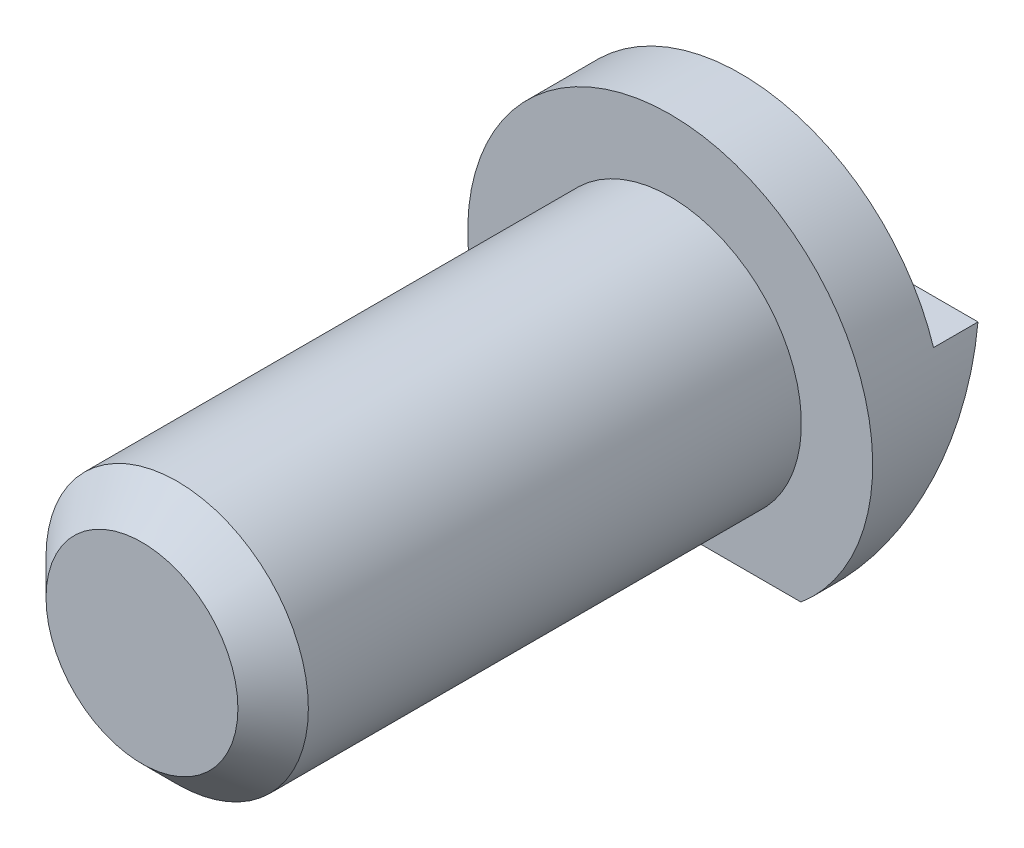
ISO-10303-21;
HEADER;
FILE_DESCRIPTION(('STEP AP214'),'2;1');
FILE_NAME('part.step','',(''),(''),'','','');
FILE_SCHEMA(('AUTOMOTIVE_DESIGN { 1 0 10303 214 1 1 1 1 }'));
ENDSEC;
DATA;
#1=APPLICATION_CONTEXT('core data for automotive mechanical design processes');
#2=APPLICATION_PROTOCOL_DEFINITION('international standard','automotive_design',2000,#1);
#3=PRODUCT_CONTEXT('',#1,'mechanical');
#4=PRODUCT('Part','Part','',(#3));
#5=PRODUCT_RELATED_PRODUCT_CATEGORY('part','',(#4));
#6=PRODUCT_DEFINITION_FORMATION('','',#4);
#7=PRODUCT_DEFINITION_CONTEXT('part definition',#1,'design');
#8=PRODUCT_DEFINITION('design','',#6,#7);
#9=PRODUCT_DEFINITION_SHAPE('','',#8);
#10=(LENGTH_UNIT() NAMED_UNIT(*) SI_UNIT(.MILLI.,.METRE.));
#11=(NAMED_UNIT(*) PLANE_ANGLE_UNIT() SI_UNIT($,.RADIAN.));
#12=(NAMED_UNIT(*) SI_UNIT($,.STERADIAN.) SOLID_ANGLE_UNIT());
#13=UNCERTAINTY_MEASURE_WITH_UNIT(LENGTH_MEASURE(1.E-05),#10,'distance_accuracy_value','');
#14=(GEOMETRIC_REPRESENTATION_CONTEXT(3) GLOBAL_UNCERTAINTY_ASSIGNED_CONTEXT((#13)) GLOBAL_UNIT_ASSIGNED_CONTEXT((#10,
#11,#12)) REPRESENTATION_CONTEXT('',''));
#15=CARTESIAN_POINT('',(0.,0.,0.));
#16=DIRECTION('',(0.,0.,1.));
#17=DIRECTION('',(1.,0.,0.));
#18=AXIS2_PLACEMENT_3D('',#15,#16,#17);
#19=CARTESIAN_POINT('',(0.,0.,15.));
#20=DIRECTION('',(0.,0.,-1.));
#21=DIRECTION('',(-1.,0.,0.));
#22=AXIS2_PLACEMENT_3D('',#19,#20,#21);
#23=CYLINDRICAL_SURFACE('',#22,3.725);
#24=CARTESIAN_POINT('',(0.,0.,14.));
#25=DIRECTION('',(0.,0.,1.));
#26=DIRECTION('',(1.,0.,0.));
#27=AXIS2_PLACEMENT_3D('',#24,#25,#26);
#28=CIRCLE('',#27,3.725);
#29=CARTESIAN_POINT('',(3.725,0.,14.));
#30=VERTEX_POINT('',#29);
#31=EDGE_CURVE('E105',#30,#30,#28,.F.);
#32=ORIENTED_EDGE('',*,*,#31,.T.);
#33=EDGE_LOOP('',(#32));
#34=FACE_BOUND('',#33,.T.);
#35=CARTESIAN_POINT('',(0.,0.,0.));
#36=DIRECTION('',(0.,0.,-1.));
#37=DIRECTION('',(-1.,0.,0.));
#38=AXIS2_PLACEMENT_3D('',#35,#36,#37);
#39=CIRCLE('',#38,3.725);
#40=CARTESIAN_POINT('',(-3.725,0.,0.));
#41=VERTEX_POINT('',#40);
#42=EDGE_CURVE('E99',#41,#41,#39,.T.);
#43=ORIENTED_EDGE('',*,*,#42,.F.);
#44=EDGE_LOOP('',(#43));
#45=FACE_BOUND('',#44,.T.);
#46=ADVANCED_FACE('F35',(#34,#45),#23,.T.);
#47=CARTESIAN_POINT('',(0.,0.,15.));
#48=DIRECTION('',(0.,0.,1.));
#49=DIRECTION('',(1.,0.,0.));
#50=AXIS2_PLACEMENT_3D('',#47,#48,#49);
#51=PLANE('',#50);
#52=CARTESIAN_POINT('',(0.,0.,15.));
#53=DIRECTION('',(0.,0.,1.));
#54=DIRECTION('',(1.,0.,0.));
#55=AXIS2_PLACEMENT_3D('',#52,#53,#54);
#56=CIRCLE('',#55,2.72499999999999);
#57=CARTESIAN_POINT('',(2.72499999999999,0.,15.));
#58=VERTEX_POINT('',#57);
#59=EDGE_CURVE('E102',#58,#58,#56,.T.);
#60=ORIENTED_EDGE('',*,*,#59,.T.);
#61=EDGE_LOOP('',(#60));
#62=FACE_BOUND('',#61,.T.);
#63=ADVANCED_FACE('F128',(#62),#51,.T.);
#64=CARTESIAN_POINT('',(0.,-4.39,-5.));
#65=DIRECTION('',(0.,1.,0.));
#66=DIRECTION('',(0.,0.,1.));
#67=AXIS2_PLACEMENT_3D('',#64,#65,#66);
#68=PLANE('',#67);
#69=DIRECTION('',(0.,0.,1.));
#70=VECTOR('',#69,1.);
#71=CARTESIAN_POINT('',(-3.71354278284228,-4.39,-5.));
#72=LINE('',#71,#70);
#73=CARTESIAN_POINT('',(-3.71354278284228,-4.39,-0.499999999999996));
#74=VERTEX_POINT('',#73);
#75=CARTESIAN_POINT('',(-3.71354278284228,-4.39,0.));
#76=VERTEX_POINT('',#75);
#77=EDGE_CURVE('E97',#74,#76,#72,.T.);
#78=ORIENTED_EDGE('',*,*,#77,.F.);
#79=DIRECTION('',(1.,0.,0.));
#80=VECTOR('',#79,1.);
#81=CARTESIAN_POINT('',(3.71354278284228,-4.39,-0.499999999999996));
#82=LINE('',#81,#80);
#83=CARTESIAN_POINT('',(3.71354278284228,-4.39,-0.499999999999997));
#84=VERTEX_POINT('',#83);
#85=EDGE_CURVE('E43',#74,#84,#82,.T.);
#86=ORIENTED_EDGE('',*,*,#85,.T.);
#87=DIRECTION('',(0.,0.,1.));
#88=VECTOR('',#87,1.);
#89=CARTESIAN_POINT('',(3.71354278284228,-4.39,-5.));
#90=LINE('',#89,#88);
#91=CARTESIAN_POINT('',(3.71354278284228,-4.39,0.));
#92=VERTEX_POINT('',#91);
#93=EDGE_CURVE('E95',#84,#92,#90,.T.);
#94=ORIENTED_EDGE('',*,*,#93,.T.);
#95=DIRECTION('',(-1.,0.,0.));
#96=VECTOR('',#95,1.);
#97=CARTESIAN_POINT('',(0.,-4.39,0.));
#98=LINE('',#97,#96);
#99=EDGE_CURVE('E88',#92,#76,#98,.T.);
#100=ORIENTED_EDGE('',*,*,#99,.T.);
#101=EDGE_LOOP('',(#78,#86,#94,#100));
#102=FACE_BOUND('',#101,.T.);
#103=ADVANCED_FACE('F113',(#102),#68,.F.);
#104=CARTESIAN_POINT('',(0.,0.,-5.));
#105=DIRECTION('',(0.,0.,1.));
#106=DIRECTION('',(1.,0.,0.));
#107=AXIS2_PLACEMENT_3D('',#104,#105,#106);
#108=CYLINDRICAL_SURFACE('',#107,5.75);
#109=CARTESIAN_POINT('',(0.,0.,-2.47549999999998));
#110=DIRECTION('',(0.,-0.410364677328796,-0.911921505175107));
#111=DIRECTION('',(0.,-0.911921505175108,0.410364677328796));
#112=AXIS2_PLACEMENT_3D('',#109,#110,#111);
#113=ELLIPSE('',#112,6.30536725734512,5.75);
#114=CARTESIAN_POINT('',(5.47722557505166,1.75,-3.26299999999998));
#115=VERTEX_POINT('',#114);
#116=EDGE_CURVE('E108',#84,#115,#113,.F.);
#117=ORIENTED_EDGE('',*,*,#116,.T.);
#118=DIRECTION('',(0.,0.,-1.));
#119=VECTOR('',#118,1.);
#120=CARTESIAN_POINT('',(5.47722557505166,1.75,-2.));
#121=LINE('',#120,#119);
#122=CARTESIAN_POINT('',(5.47722557505166,1.75,-2.));
#123=VERTEX_POINT('',#122);
#124=EDGE_CURVE('E49',#123,#115,#121,.T.);
#125=ORIENTED_EDGE('',*,*,#124,.F.);
#126=CARTESIAN_POINT('',(0.,0.,-2.));
#127=DIRECTION('',(0.,0.,-1.));
#128=DIRECTION('',(-1.,0.,0.));
#129=AXIS2_PLACEMENT_3D('',#126,#127,#128);
#130=CIRCLE('',#129,5.75);
#131=CARTESIAN_POINT('',(-5.47722557505166,1.75,-2.));
#132=VERTEX_POINT('',#131);
#133=EDGE_CURVE('E79',#132,#123,#130,.T.);
#134=ORIENTED_EDGE('',*,*,#133,.F.);
#135=DIRECTION('',(0.,0.,-1.));
#136=VECTOR('',#135,1.);
#137=CARTESIAN_POINT('',(-5.47722557505166,1.75,-2.));
#138=LINE('',#137,#136);
#139=CARTESIAN_POINT('',(-5.47722557505166,1.75,-3.26299999999998));
#140=VERTEX_POINT('',#139);
#141=EDGE_CURVE('E73',#132,#140,#138,.T.);
#142=ORIENTED_EDGE('',*,*,#141,.T.);
#143=CARTESIAN_POINT('',(0.,0.,-2.47549999999998));
#144=DIRECTION('',(0.,-0.410364677328796,-0.911921505175107));
#145=DIRECTION('',(0.,-0.911921505175108,0.410364677328796));
#146=AXIS2_PLACEMENT_3D('',#143,#144,#145);
#147=ELLIPSE('',#146,6.30536725734512,5.75);
#148=EDGE_CURVE('E57',#140,#74,#147,.F.);
#149=ORIENTED_EDGE('',*,*,#148,.T.);
#150=ORIENTED_EDGE('',*,*,#77,.T.);
#151=CARTESIAN_POINT('',(0.,0.,0.));
#152=DIRECTION('',(0.,0.,-1.));
#153=DIRECTION('',(-1.,0.,0.));
#154=AXIS2_PLACEMENT_3D('',#151,#152,#153);
#155=CIRCLE('',#154,5.75);
#156=EDGE_CURVE('E92',#76,#92,#155,.T.);
#157=ORIENTED_EDGE('',*,*,#156,.T.);
#158=ORIENTED_EDGE('',*,*,#93,.F.);
#159=EDGE_LOOP('',(#117,#125,#134,#142,#149,#150,#157,#158));
#160=FACE_BOUND('',#159,.T.);
#161=ADVANCED_FACE('F85',(#160),#108,.T.);
#162=CARTESIAN_POINT('',(0.,0.,0.));
#163=DIRECTION('',(0.,0.,-1.));
#164=DIRECTION('',(-1.,0.,0.));
#165=AXIS2_PLACEMENT_3D('',#162,#163,#164);
#166=PLANE('',#165);
#167=ORIENTED_EDGE('',*,*,#42,.T.);
#168=EDGE_LOOP('',(#167));
#169=FACE_BOUND('',#168,.T.);
#170=ORIENTED_EDGE('',*,*,#99,.F.);
#171=ORIENTED_EDGE('',*,*,#156,.F.);
#172=EDGE_LOOP('',(#170,#171));
#173=FACE_BOUND('',#172,.T.);
#174=ADVANCED_FACE('F125',(#169,#173),#166,.F.);
#175=CARTESIAN_POINT('',(0.,0.,15.));
#176=DIRECTION('',(0.,0.,-1.));
#177=DIRECTION('',(-1.,0.,0.));
#178=AXIS2_PLACEMENT_3D('',#175,#176,#177);
#179=CONICAL_SURFACE('',#178,2.72499999999999,0.785398163397447);
#180=ORIENTED_EDGE('',*,*,#31,.F.);
#181=EDGE_LOOP('',(#180));
#182=FACE_BOUND('',#181,.T.);
#183=ORIENTED_EDGE('',*,*,#59,.F.);
#184=EDGE_LOOP('',(#183));
#185=FACE_BOUND('',#184,.T.);
#186=ADVANCED_FACE('F119',(#182,#185),#179,.T.);
#187=CARTESIAN_POINT('',(0.,5.61000000000007,-5.));
#188=DIRECTION('',(0.,-0.410364677328796,-0.911921505175107));
#189=DIRECTION('',(1.,0.,0.));
#190=AXIS2_PLACEMENT_3D('',#187,#188,#189);
#191=PLANE('',#190);
#192=DIRECTION('',(-1.,0.,0.));
#193=VECTOR('',#192,1.);
#194=CARTESIAN_POINT('',(0.,1.75,-3.26299999999998));
#195=LINE('',#194,#193);
#196=EDGE_CURVE('E11',#115,#140,#195,.T.);
#197=ORIENTED_EDGE('',*,*,#196,.F.);
#198=ORIENTED_EDGE('',*,*,#116,.F.);
#199=ORIENTED_EDGE('',*,*,#85,.F.);
#200=ORIENTED_EDGE('',*,*,#148,.F.);
#201=EDGE_LOOP('',(#197,#198,#199,#200));
#202=FACE_BOUND('',#201,.T.);
#203=ADVANCED_FACE('F37',(#202),#191,.T.);
#204=CARTESIAN_POINT('',(0.,1.75,-2.));
#205=DIRECTION('',(0.,-1.,0.));
#206=DIRECTION('',(0.,0.,-1.));
#207=AXIS2_PLACEMENT_3D('',#204,#205,#206);
#208=PLANE('',#207);
#209=ORIENTED_EDGE('',*,*,#196,.T.);
#210=ORIENTED_EDGE('',*,*,#141,.F.);
#211=DIRECTION('',(-1.,0.,0.));
#212=VECTOR('',#211,1.);
#213=CARTESIAN_POINT('',(0.,1.75,-2.));
#214=LINE('',#213,#212);
#215=EDGE_CURVE('E76',#123,#132,#214,.T.);
#216=ORIENTED_EDGE('',*,*,#215,.F.);
#217=ORIENTED_EDGE('',*,*,#124,.T.);
#218=EDGE_LOOP('',(#209,#210,#216,#217));
#219=FACE_BOUND('',#218,.T.);
#220=ADVANCED_FACE('F75',(#219),#208,.F.);
#221=CARTESIAN_POINT('',(0.,0.,-2.));
#222=DIRECTION('',(0.,0.,-1.));
#223=DIRECTION('',(-1.,0.,0.));
#224=AXIS2_PLACEMENT_3D('',#221,#222,#223);
#225=PLANE('',#224);
#226=ORIENTED_EDGE('',*,*,#215,.T.);
#227=ORIENTED_EDGE('',*,*,#133,.T.);
#228=EDGE_LOOP('',(#226,#227));
#229=FACE_BOUND('',#228,.T.);
#230=ADVANCED_FACE('F82',(#229),#225,.T.);
#231=CLOSED_SHELL('',(#46,#63,#103,#161,#174,#186,#203,#220,#230));
#232=MANIFOLD_SOLID_BREP('B2',#231);
#233=ADVANCED_BREP_SHAPE_REPRESENTATION('',(#18,#232),#14);
#234=SHAPE_DEFINITION_REPRESENTATION(#9,#233);
ENDSEC;
END-ISO-10303-21;
